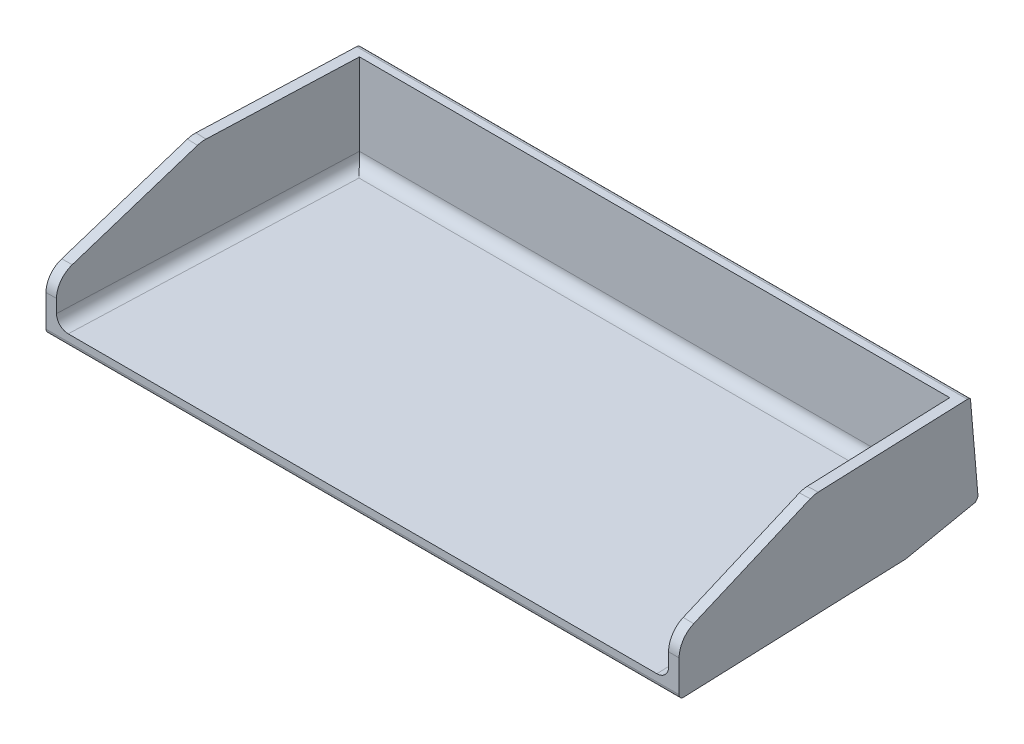
ISO-10303-21;
HEADER;
FILE_DESCRIPTION(('STEP AP214'),'2;1');
FILE_NAME('part.step','',(''),(''),'','','');
FILE_SCHEMA(('AUTOMOTIVE_DESIGN { 1 0 10303 214 1 1 1 1 }'));
ENDSEC;
DATA;
#1=APPLICATION_CONTEXT('core data for automotive mechanical design processes');
#2=APPLICATION_PROTOCOL_DEFINITION('international standard','automotive_design',2000,#1);
#3=PRODUCT_CONTEXT('',#1,'mechanical');
#4=PRODUCT('Part','Part','',(#3));
#5=PRODUCT_RELATED_PRODUCT_CATEGORY('part','',(#4));
#6=PRODUCT_DEFINITION_FORMATION('','',#4);
#7=PRODUCT_DEFINITION_CONTEXT('part definition',#1,'design');
#8=PRODUCT_DEFINITION('design','',#6,#7);
#9=PRODUCT_DEFINITION_SHAPE('','',#8);
#10=(LENGTH_UNIT() NAMED_UNIT(*) SI_UNIT(.MILLI.,.METRE.));
#11=(NAMED_UNIT(*) PLANE_ANGLE_UNIT() SI_UNIT($,.RADIAN.));
#12=(NAMED_UNIT(*) SI_UNIT($,.STERADIAN.) SOLID_ANGLE_UNIT());
#13=UNCERTAINTY_MEASURE_WITH_UNIT(LENGTH_MEASURE(1.E-05),#10,'distance_accuracy_value','');
#14=(GEOMETRIC_REPRESENTATION_CONTEXT(3) GLOBAL_UNCERTAINTY_ASSIGNED_CONTEXT((#13)) GLOBAL_UNIT_ASSIGNED_CONTEXT((#10,
#11,#12)) REPRESENTATION_CONTEXT('',''));
#15=CARTESIAN_POINT('',(0.,0.,0.));
#16=DIRECTION('',(0.,0.,1.));
#17=DIRECTION('',(1.,0.,0.));
#18=AXIS2_PLACEMENT_3D('',#15,#16,#17);
#19=CARTESIAN_POINT('',(0.,43.,-128.169892089231));
#20=DIRECTION('',(-1.,0.,0.));
#21=DIRECTION('',(0.,0.,1.));
#22=AXIS2_PLACEMENT_3D('',#19,#20,#21);
#23=CYLINDRICAL_SURFACE('',#22,2.);
#24=CARTESIAN_POINT('',(266.717193387957,43.,-128.169892089231));
#25=DIRECTION('',(-0.999304579951777,0.,0.037287484326559));
#26=DIRECTION('',(-0.037287484326559,0.,-0.999304579951777));
#27=AXIS2_PLACEMENT_3D('',#24,#25,#26);
#28=ELLIPSE('',#27,2.00139180798762,2.);
#29=CARTESIAN_POINT('',(266.665813469005,44.4504899329398,-129.546873917157));
#30=VERTEX_POINT('',#29);
#31=CARTESIAN_POINT('',(266.717193387957,45.,-128.169892089231));
#32=VERTEX_POINT('',#31);
#33=EDGE_CURVE('E181',#30,#32,#28,.F.);
#34=ORIENTED_EDGE('',*,*,#33,.F.);
#35=DIRECTION('',(-1.,0.,0.));
#36=VECTOR('',#35,1.);
#37=CARTESIAN_POINT('',(0.,44.4504899329398,-129.546873917157));
#38=LINE('',#37,#36);
#39=CARTESIAN_POINT('',(5.33418653099532,44.4504899329398,-129.546873917158));
#40=VERTEX_POINT('',#39);
#41=EDGE_CURVE('E170',#30,#40,#38,.T.);
#42=ORIENTED_EDGE('',*,*,#41,.T.);
#43=CARTESIAN_POINT('',(5.28280661204283,43.,-128.169892089231));
#44=DIRECTION('',(0.999304579951777,0.,0.0372874843265588));
#45=DIRECTION('',(-0.0372874843265588,0.,0.999304579951777));
#46=AXIS2_PLACEMENT_3D('',#43,#44,#45);
#47=ELLIPSE('',#46,2.00139180798762,2.);
#48=CARTESIAN_POINT('',(5.28280661204283,45.,-128.169892089231));
#49=VERTEX_POINT('',#48);
#50=EDGE_CURVE('E179',#49,#40,#47,.F.);
#51=ORIENTED_EDGE('',*,*,#50,.F.);
#52=DIRECTION('',(-1.,0.,0.));
#53=VECTOR('',#52,1.);
#54=CARTESIAN_POINT('',(0.,45.,-128.169892089231));
#55=LINE('',#54,#53);
#56=EDGE_CURVE('E315',#32,#49,#55,.T.);
#57=ORIENTED_EDGE('',*,*,#56,.F.);
#58=EDGE_LOOP('',(#34,#42,#51,#57));
#59=FACE_BOUND('',#58,.T.);
#60=ADVANCED_FACE('F33',(#59),#23,.T.);
#61=CARTESIAN_POINT('',(-55.7709361070454,8.48224818282541,-128.226308162382));
#62=DIRECTION('',(1.,0.,0.));
#63=DIRECTION('',(0.,0.,-1.));
#64=AXIS2_PLACEMENT_3D('',#61,#62,#63);
#65=CYLINDRICAL_SURFACE('',#64,5.);
#66=CARTESIAN_POINT('',(5.2849116893992,8.48224818282541,-128.226308162382));
#67=DIRECTION('',(0.999304579951777,0.,0.0372874843265588));
#68=DIRECTION('',(0.0372874843265588,0.,-0.999304579951777));
#69=AXIS2_PLACEMENT_3D('',#66,#67,#68);
#70=ELLIPSE('',#69,5.00347951996906,5.);
#71=CARTESIAN_POINT('',(5.45936299097688,6.70978724849995,-132.901603044663));
#72=VERTEX_POINT('',#71);
#73=CARTESIAN_POINT('',(5.41879334504449,5.,-131.814336533675));
#74=VERTEX_POINT('',#73);
#75=EDGE_CURVE('E41',#72,#74,#70,.F.);
#76=ORIENTED_EDGE('',*,*,#75,.F.);
#77=DIRECTION('',(1.,0.,0.));
#78=VECTOR('',#77,1.);
#79=CARTESIAN_POINT('',(-55.7709361070454,6.70978724849992,-132.901603044663));
#80=LINE('',#79,#78);
#81=CARTESIAN_POINT('',(266.540637009023,6.70978724849992,-132.901603044663));
#82=VERTEX_POINT('',#81);
#83=EDGE_CURVE('E47',#72,#82,#80,.T.);
#84=ORIENTED_EDGE('',*,*,#83,.T.);
#85=CARTESIAN_POINT('',(266.715088310601,8.48224818282541,-128.226308162382));
#86=DIRECTION('',(-0.999304579951777,0.,0.037287484326559));
#87=DIRECTION('',(0.037287484326559,0.,0.999304579951777));
#88=AXIS2_PLACEMENT_3D('',#85,#86,#87);
#89=ELLIPSE('',#88,5.00347951996906,5.);
#90=CARTESIAN_POINT('',(266.581206654956,5.,-131.814336533675));
#91=VERTEX_POINT('',#90);
#92=EDGE_CURVE('E317',#91,#82,#89,.F.);
#93=ORIENTED_EDGE('',*,*,#92,.F.);
#94=DIRECTION('',(1.,0.,0.));
#95=VECTOR('',#94,1.);
#96=CARTESIAN_POINT('',(-55.7709361070454,5.,-131.814336533675));
#97=LINE('',#96,#95);
#98=EDGE_CURVE('E55',#74,#91,#97,.T.);
#99=ORIENTED_EDGE('',*,*,#98,.F.);
#100=EDGE_LOOP('',(#76,#84,#93,#99));
#101=FACE_BOUND('',#100,.T.);
#102=ADVANCED_FACE('F35',(#101),#65,.T.);
#103=CARTESIAN_POINT('',(271.122170745451,0.,-10.1164989084124));
#104=DIRECTION('',(-0.999304579951777,0.,0.037287484326559));
#105=DIRECTION('',(0.037287484326559,0.,0.999304579951777));
#106=AXIS2_PLACEMENT_3D('',#103,#104,#105);
#107=PLANE('',#106);
#108=DIRECTION('',(-0.00330370548880731,-0.996067204875398,-0.0885393071000354));
#109=VECTOR('',#108,1.);
#110=CARTESIAN_POINT('',(266.554522632027,10.8963025840758,-132.529468348168));
#111=LINE('',#110,#109);
#112=EDGE_CURVE('E182',#30,#82,#111,.T.);
#113=ORIENTED_EDGE('',*,*,#112,.F.);
#114=ORIENTED_EDGE('',*,*,#33,.T.);
#115=DIRECTION('',(-0.037287484326559,0.,-0.999304579951777));
#116=VECTOR('',#115,1.);
#117=CARTESIAN_POINT('',(271.122170745451,45.,-10.1164989084124));
#118=LINE('',#117,#116);
#119=CARTESIAN_POINT('',(269.192205568468,45.,-61.8395656515565));
#120=VERTEX_POINT('',#119);
#121=EDGE_CURVE('E215',#120,#32,#118,.T.);
#122=ORIENTED_EDGE('',*,*,#121,.F.);
#123=CARTESIAN_POINT('',(269.192205568468,35.,-61.8395656515565));
#124=DIRECTION('',(-0.999304579951777,0.,0.037287484326559));
#125=DIRECTION('',(0.037287484326559,0.,0.999304579951777));
#126=AXIS2_PLACEMENT_3D('',#123,#124,#125);
#127=CIRCLE('',#126,10.);
#128=CARTESIAN_POINT('',(269.322957809309,44.3650288928351,-58.33540559701));
#129=VERTEX_POINT('',#128);
#130=EDGE_CURVE('E221',#120,#129,#127,.F.);
#131=ORIENTED_EDGE('',*,*,#130,.T.);
#132=DIRECTION('',(-0.0349198368059359,0.350659861352347,-0.935851626399078));
#133=VECTOR('',#132,1.);
#134=CARTESIAN_POINT('',(271.500347710024,22.5,0.0186437421632748));
#135=LINE('',#134,#133);
#136=CARTESIAN_POINT('',(271.257269960486,24.9409509822315,-6.49583994545344));
#137=VERTEX_POINT('',#136);
#138=EDGE_CURVE('E225',#137,#129,#135,.T.);
#139=ORIENTED_EDGE('',*,*,#138,.F.);
#140=CARTESIAN_POINT('',(271.126517719645,15.5759220893965,-10.));
#141=DIRECTION('',(-0.999304579951777,0.,0.037287484326559));
#142=DIRECTION('',(-0.0349198368059359,0.350659861352346,-0.935851626399079));
#143=AXIS2_PLACEMENT_3D('',#140,#141,#142);
#144=ELLIPSE('',#143,10.0079343237185,10.);
#145=CARTESIAN_POINT('',(271.499652048003,15.5707124792473,0.));
#146=VERTEX_POINT('',#145);
#147=EDGE_CURVE('E223',#137,#146,#144,.F.);
#148=ORIENTED_EDGE('',*,*,#147,.T.);
#149=DIRECTION('',(0.,1.,0.));
#150=VECTOR('',#149,1.);
#151=CARTESIAN_POINT('',(271.499652048003,45.,0.));
#152=LINE('',#151,#150);
#153=CARTESIAN_POINT('',(271.499652048003,2.,0.));
#154=VERTEX_POINT('',#153);
#155=EDGE_CURVE('E218',#154,#146,#152,.T.);
#156=ORIENTED_EDGE('',*,*,#155,.F.);
#157=CARTESIAN_POINT('',(271.425025182332,2.,-2.));
#158=DIRECTION('',(-0.999304579951777,0.,0.037287484326559));
#159=DIRECTION('',(-0.037287484326559,0.,-0.999304579951777));
#160=AXIS2_PLACEMENT_3D('',#157,#158,#159);
#161=ELLIPSE('',#160,2.00139180798762,2.);
#162=CARTESIAN_POINT('',(271.425025182332,0.,-2.));
#163=VERTEX_POINT('',#162);
#164=EDGE_CURVE('E213',#154,#163,#161,.F.);
#165=ORIENTED_EDGE('',*,*,#164,.T.);
#166=DIRECTION('',(0.037287484326559,0.,0.999304579951777));
#167=VECTOR('',#166,1.);
#168=CARTESIAN_POINT('',(271.122170745451,0.,-10.1164989084124));
#169=LINE('',#168,#167);
#170=CARTESIAN_POINT('',(267.736927504683,0.,-100.841017760975));
#171=VERTEX_POINT('',#170);
#172=EDGE_CURVE('E209',#171,#163,#169,.T.);
#173=ORIENTED_EDGE('',*,*,#172,.F.);
#174=DIRECTION('',(0.0368115834188894,-0.159258109030245,0.98655043562623));
#175=VECTOR('',#174,1.);
#176=CARTESIAN_POINT('',(268.452699109656,-3.09664572176336,-81.6583387477167));
#177=LINE('',#176,#175);
#178=EDGE_CURVE('E207',#91,#171,#177,.T.);
#179=ORIENTED_EDGE('',*,*,#178,.F.);
#180=ORIENTED_EDGE('',*,*,#92,.T.);
#181=EDGE_LOOP('',(#113,#114,#122,#131,#139,#148,#156,#165,#173,#179,#180));
#182=FACE_BOUND('',#181,.T.);
#183=ADVANCED_FACE('F324',(#182),#107,.F.);
#184=CARTESIAN_POINT('',(0.499652289975889,0.,0.0186437421632794));
#185=DIRECTION('',(0.999304579951777,0.,0.0372874843265588));
#186=DIRECTION('',(0.0372874843265588,0.,-0.999304579951777));
#187=AXIS2_PLACEMENT_3D('',#184,#185,#186);
#188=PLANE('',#187);
#189=DIRECTION('',(-0.00330370548880729,0.996067204875398,0.0885393071000354));
#190=VECTOR('',#189,1.);
#191=CARTESIAN_POINT('',(5.44250863214507,11.7913764362911,-132.449906227971));
#192=LINE('',#191,#190);
#193=EDGE_CURVE('E11',#72,#40,#192,.T.);
#194=ORIENTED_EDGE('',*,*,#193,.F.);
#195=ORIENTED_EDGE('',*,*,#75,.T.);
#196=DIRECTION('',(0.0368115834188892,0.159258109030245,-0.98655043562623));
#197=VECTOR('',#196,1.);
#198=CARTESIAN_POINT('',(3.02756610920945,-5.34517650347241,-67.7294466132962));
#199=LINE('',#198,#197);
#200=CARTESIAN_POINT('',(4.26307249531688,0.,-100.841017760975));
#201=VERTEX_POINT('',#200);
#202=EDGE_CURVE('E192',#201,#74,#199,.T.);
#203=ORIENTED_EDGE('',*,*,#202,.F.);
#204=DIRECTION('',(0.0372874843265588,0.,-0.999304579951777));
#205=VECTOR('',#204,1.);
#206=CARTESIAN_POINT('',(0.499652289975889,0.,0.0186437421632794));
#207=LINE('',#206,#205);
#208=CARTESIAN_POINT('',(0.574974817668549,0.,-2.));
#209=VERTEX_POINT('',#208);
#210=EDGE_CURVE('E188',#209,#201,#207,.T.);
#211=ORIENTED_EDGE('',*,*,#210,.F.);
#212=CARTESIAN_POINT('',(0.574974817668549,2.,-2.));
#213=DIRECTION('',(0.999304579951777,0.,0.0372874843265588));
#214=DIRECTION('',(-0.0372874843265588,0.,0.999304579951777));
#215=AXIS2_PLACEMENT_3D('',#212,#213,#214);
#216=ELLIPSE('',#215,2.00139180798762,2.);
#217=CARTESIAN_POINT('',(0.500347951996937,2.,0.));
#218=VERTEX_POINT('',#217);
#219=EDGE_CURVE('E187',#209,#218,#216,.F.);
#220=ORIENTED_EDGE('',*,*,#219,.T.);
#221=DIRECTION('',(0.,-1.,0.));
#222=VECTOR('',#221,1.);
#223=CARTESIAN_POINT('',(0.500347951996907,45.,0.));
#224=LINE('',#223,#222);
#225=CARTESIAN_POINT('',(0.500347951996907,15.5707124792473,0.));
#226=VERTEX_POINT('',#225);
#227=EDGE_CURVE('E197',#226,#218,#224,.T.);
#228=ORIENTED_EDGE('',*,*,#227,.F.);
#229=CARTESIAN_POINT('',(0.873482280355116,15.5759220893965,-10.));
#230=DIRECTION('',(0.999304579951777,0.,0.0372874843265588));
#231=DIRECTION('',(-0.0349198368059357,-0.350659861352347,0.935851626399078));
#232=AXIS2_PLACEMENT_3D('',#229,#230,#231);
#233=ELLIPSE('',#232,10.0079343237185,10.);
#234=CARTESIAN_POINT('',(0.742730039513826,24.9409509822315,-6.49583994545344));
#235=VERTEX_POINT('',#234);
#236=EDGE_CURVE('E202',#226,#235,#233,.F.);
#237=ORIENTED_EDGE('',*,*,#236,.T.);
#238=DIRECTION('',(-0.0349198368059357,-0.350659861352347,0.935851626399078));
#239=VECTOR('',#238,1.);
#240=CARTESIAN_POINT('',(0.499652289975889,22.5,0.0186437421632795));
#241=LINE('',#240,#239);
#242=CARTESIAN_POINT('',(2.67704219069131,44.365028892835,-58.3354055970099));
#243=VERTEX_POINT('',#242);
#244=EDGE_CURVE('E204',#243,#235,#241,.T.);
#245=ORIENTED_EDGE('',*,*,#244,.F.);
#246=CARTESIAN_POINT('',(2.8077944315326,35.,-61.8395656515565));
#247=DIRECTION('',(0.999304579951777,0.,0.0372874843265588));
#248=DIRECTION('',(0.0372874843265588,0.,-0.999304579951777));
#249=AXIS2_PLACEMENT_3D('',#246,#247,#248);
#250=CIRCLE('',#249,10.);
#251=CARTESIAN_POINT('',(2.8077944315326,45.,-61.8395656515565));
#252=VERTEX_POINT('',#251);
#253=EDGE_CURVE('E200',#243,#252,#250,.F.);
#254=ORIENTED_EDGE('',*,*,#253,.T.);
#255=DIRECTION('',(-0.0372874843265588,0.,0.999304579951777));
#256=VECTOR('',#255,1.);
#257=CARTESIAN_POINT('',(0.499652289975889,45.,0.0186437421632794));
#258=LINE('',#257,#256);
#259=EDGE_CURVE('E186',#49,#252,#258,.T.);
#260=ORIENTED_EDGE('',*,*,#259,.F.);
#261=ORIENTED_EDGE('',*,*,#50,.T.);
#262=EDGE_LOOP('',(#194,#195,#203,#211,#220,#228,#237,#245,#254,#260,#261));
#263=FACE_BOUND('',#262,.T.);
#264=ADVANCED_FACE('F184',(#263),#188,.F.);
#265=CARTESIAN_POINT('',(0.,45.,0.));
#266=DIRECTION('',(0.,0.,-1.));
#267=DIRECTION('',(-1.,0.,0.));
#268=AXIS2_PLACEMENT_3D('',#265,#266,#267);
#269=PLANE('',#268);
#270=DIRECTION('',(-0.999902548942784,-0.0139603946120456,0.));
#271=VECTOR('',#270,1.);
#272=CARTESIAN_POINT('',(0.41090194383554,15.5694636559777,0.));
#273=LINE('',#272,#271);
#274=CARTESIAN_POINT('',(5.,15.633535519626,0.));
#275=VERTEX_POINT('',#274);
#276=EDGE_CURVE('E261',#275,#226,#273,.T.);
#277=ORIENTED_EDGE('',*,*,#276,.T.);
#278=ORIENTED_EDGE('',*,*,#227,.T.);
#279=DIRECTION('',(1.,0.,0.));
#280=VECTOR('',#279,1.);
#281=CARTESIAN_POINT('',(272.,2.,0.));
#282=LINE('',#281,#280);
#283=EDGE_CURVE('E310',#218,#154,#282,.T.);
#284=ORIENTED_EDGE('',*,*,#283,.T.);
#285=ORIENTED_EDGE('',*,*,#155,.T.);
#286=DIRECTION('',(-0.999902548942784,0.0139603946120456,0.));
#287=VECTOR('',#286,1.);
#288=CARTESIAN_POINT('',(-0.357891151814604,19.3663209466359,0.));
#289=LINE('',#288,#287);
#290=CARTESIAN_POINT('',(267.,15.633535519626,0.));
#291=VERTEX_POINT('',#290);
#292=EDGE_CURVE('E264',#146,#291,#289,.T.);
#293=ORIENTED_EDGE('',*,*,#292,.T.);
#294=DIRECTION('',(0.,1.,0.));
#295=VECTOR('',#294,1.);
#296=CARTESIAN_POINT('',(267.,5.,0.));
#297=LINE('',#296,#295);
#298=CARTESIAN_POINT('',(267.,10.,0.));
#299=VERTEX_POINT('',#298);
#300=EDGE_CURVE('E252',#299,#291,#297,.T.);
#301=ORIENTED_EDGE('',*,*,#300,.F.);
#302=CARTESIAN_POINT('',(261.996520480031,10.,0.));
#303=DIRECTION('',(0.,0.,-1.));
#304=DIRECTION('',(1.,0.,0.));
#305=AXIS2_PLACEMENT_3D('',#302,#303,#304);
#306=ELLIPSE('',#305,5.00347951996906,5.);
#307=CARTESIAN_POINT('',(261.996520480031,5.,0.));
#308=VERTEX_POINT('',#307);
#309=EDGE_CURVE('E289',#299,#308,#306,.T.);
#310=ORIENTED_EDGE('',*,*,#309,.T.);
#311=DIRECTION('',(1.,0.,0.));
#312=VECTOR('',#311,1.);
#313=CARTESIAN_POINT('',(5.,5.,0.));
#314=LINE('',#313,#312);
#315=CARTESIAN_POINT('',(10.0034795199691,5.,0.));
#316=VERTEX_POINT('',#315);
#317=EDGE_CURVE('E233',#316,#308,#314,.T.);
#318=ORIENTED_EDGE('',*,*,#317,.F.);
#319=CARTESIAN_POINT('',(10.0034795199691,10.,0.));
#320=DIRECTION('',(0.,0.,-1.));
#321=DIRECTION('',(1.,0.,0.));
#322=AXIS2_PLACEMENT_3D('',#319,#320,#321);
#323=ELLIPSE('',#322,5.00347951996906,5.);
#324=CARTESIAN_POINT('',(5.,10.,0.));
#325=VERTEX_POINT('',#324);
#326=EDGE_CURVE('E291',#316,#325,#323,.T.);
#327=ORIENTED_EDGE('',*,*,#326,.T.);
#328=DIRECTION('',(0.,1.,0.));
#329=VECTOR('',#328,1.);
#330=CARTESIAN_POINT('',(5.,5.,0.));
#331=LINE('',#330,#329);
#332=EDGE_CURVE('E236',#325,#275,#331,.T.);
#333=ORIENTED_EDGE('',*,*,#332,.T.);
#334=EDGE_LOOP('',(#277,#278,#284,#285,#293,#301,#310,#318,#327,#333));
#335=FACE_BOUND('',#334,.T.);
#336=ADVANCED_FACE('F335',(#335),#269,.F.);
#337=CARTESIAN_POINT('',(0.,45.,0.));
#338=DIRECTION('',(0.,-1.,0.));
#339=DIRECTION('',(0.,0.,-1.));
#340=AXIS2_PLACEMENT_3D('',#337,#338,#339);
#341=PLANE('',#340);
#342=ORIENTED_EDGE('',*,*,#56,.T.);
#343=ORIENTED_EDGE('',*,*,#259,.T.);
#344=DIRECTION('',(-0.999304579951777,0.,-0.0372874843265588));
#345=VECTOR('',#344,1.);
#346=CARTESIAN_POINT('',(2.30814214155671,45.,-61.8582093937198));
#347=LINE('',#346,#345);
#348=CARTESIAN_POINT('',(7.30119035911966,45.,-61.6719016244077));
#349=VERTEX_POINT('',#348);
#350=EDGE_CURVE('E293',#252,#349,#347,.F.);
#351=ORIENTED_EDGE('',*,*,#350,.T.);
#352=DIRECTION('',(-0.0372874843265584,0.,0.999304579951777));
#353=VECTOR('',#352,1.);
#354=CARTESIAN_POINT('',(5.,45.,0.));
#355=LINE('',#354,#353);
#356=CARTESIAN_POINT('',(9.66417910447755,45.,-125.));
#357=VERTEX_POINT('',#356);
#358=EDGE_CURVE('E238',#357,#349,#355,.T.);
#359=ORIENTED_EDGE('',*,*,#358,.F.);
#360=DIRECTION('',(-1.,0.,0.));
#361=VECTOR('',#360,1.);
#362=CARTESIAN_POINT('',(9.66417910447755,45.,-125.));
#363=LINE('',#362,#361);
#364=CARTESIAN_POINT('',(262.335820895522,45.,-125.));
#365=VERTEX_POINT('',#364);
#366=EDGE_CURVE('E237',#365,#357,#363,.T.);
#367=ORIENTED_EDGE('',*,*,#366,.F.);
#368=DIRECTION('',(-0.037287484326559,0.,-0.999304579951777));
#369=VECTOR('',#368,1.);
#370=CARTESIAN_POINT('',(262.335820895522,45.,-125.));
#371=LINE('',#370,#369);
#372=CARTESIAN_POINT('',(264.69880964088,45.,-61.6719016244077));
#373=VERTEX_POINT('',#372);
#374=EDGE_CURVE('E241',#373,#365,#371,.T.);
#375=ORIENTED_EDGE('',*,*,#374,.F.);
#376=DIRECTION('',(0.999304579951777,0.,-0.0372874843265589));
#377=VECTOR('',#376,1.);
#378=CARTESIAN_POINT('',(-1.92996517698299,45.,-51.7230667431442));
#379=LINE('',#378,#377);
#380=EDGE_CURVE('E298',#373,#120,#379,.T.);
#381=ORIENTED_EDGE('',*,*,#380,.T.);
#382=ORIENTED_EDGE('',*,*,#121,.T.);
#383=EDGE_LOOP('',(#342,#343,#351,#359,#367,#375,#381,#382));
#384=FACE_BOUND('',#383,.T.);
#385=ADVANCED_FACE('F355',(#384),#341,.F.);
#386=CARTESIAN_POINT('',(5.,5.,0.));
#387=DIRECTION('',(-0.999304579951777,0.,-0.0372874843265584));
#388=DIRECTION('',(-0.0372874843265584,0.,0.999304579951777));
#389=AXIS2_PLACEMENT_3D('',#386,#387,#388);
#390=PLANE('',#389);
#391=ORIENTED_EDGE('',*,*,#358,.T.);
#392=CARTESIAN_POINT('',(7.30119035911966,35.,-61.6719016244077));
#393=DIRECTION('',(-0.999304579951777,0.,-0.0372874843265584));
#394=DIRECTION('',(-0.0372874843265584,0.,0.999304579951777));
#395=AXIS2_PLACEMENT_3D('',#392,#393,#394);
#396=CIRCLE('',#395,10.);
#397=CARTESIAN_POINT('',(7.17043811827837,44.365028892835,-58.1677415698612));
#398=VERTEX_POINT('',#397);
#399=EDGE_CURVE('E308',#349,#398,#396,.F.);
#400=ORIENTED_EDGE('',*,*,#399,.T.);
#401=DIRECTION('',(-0.0349198368059353,-0.350659861352347,0.935851626399078));
#402=VECTOR('',#401,1.);
#403=CARTESIAN_POINT('',(4.78485795275147,20.4093840043003,5.76580686626064));
#404=LINE('',#403,#402);
#405=CARTESIAN_POINT('',(5.24238208751692,25.0037740226103,-6.49583994545344));
#406=VERTEX_POINT('',#405);
#407=EDGE_CURVE('E248',#398,#406,#404,.T.);
#408=ORIENTED_EDGE('',*,*,#407,.T.);
#409=CARTESIAN_POINT('',(5.3731343283582,15.6387451297752,-10.));
#410=DIRECTION('',(-0.999304579951777,0.,-0.0372874843265584));
#411=DIRECTION('',(-0.0349198368059353,-0.350659861352351,0.935851626399077));
#412=AXIS2_PLACEMENT_3D('',#409,#410,#411);
#413=ELLIPSE('',#412,10.0079343237185,10.);
#414=EDGE_CURVE('E273',#406,#275,#413,.F.);
#415=ORIENTED_EDGE('',*,*,#414,.T.);
#416=ORIENTED_EDGE('',*,*,#332,.F.);
#417=DIRECTION('',(-0.0372874843265584,0.,0.999304579951777));
#418=VECTOR('',#417,1.);
#419=CARTESIAN_POINT('',(9.66417910447755,10.,-125.));
#420=LINE('',#419,#418);
#421=CARTESIAN_POINT('',(9.66417910447755,10.,-125.));
#422=VERTEX_POINT('',#421);
#423=EDGE_CURVE('E287',#325,#422,#420,.F.);
#424=ORIENTED_EDGE('',*,*,#423,.T.);
#425=DIRECTION('',(0.,1.,0.));
#426=VECTOR('',#425,1.);
#427=CARTESIAN_POINT('',(9.66417910447755,5.,-125.));
#428=LINE('',#427,#426);
#429=EDGE_CURVE('E246',#422,#357,#428,.T.);
#430=ORIENTED_EDGE('',*,*,#429,.T.);
#431=EDGE_LOOP('',(#391,#400,#408,#415,#416,#424,#430));
#432=FACE_BOUND('',#431,.T.);
#433=ADVANCED_FACE('F384',(#432),#390,.F.);
#434=CARTESIAN_POINT('',(9.66417910447755,5.,-125.));
#435=DIRECTION('',(0.,0.,-1.));
#436=DIRECTION('',(-1.,0.,0.));
#437=AXIS2_PLACEMENT_3D('',#434,#435,#436);
#438=PLANE('',#437);
#439=ORIENTED_EDGE('',*,*,#429,.F.);
#440=DIRECTION('',(-1.,0.,0.));
#441=VECTOR('',#440,1.);
#442=CARTESIAN_POINT('',(262.335820895522,10.,-125.));
#443=LINE('',#442,#441);
#444=CARTESIAN_POINT('',(262.335820895522,10.,-125.));
#445=VERTEX_POINT('',#444);
#446=EDGE_CURVE('E285',#422,#445,#443,.F.);
#447=ORIENTED_EDGE('',*,*,#446,.T.);
#448=DIRECTION('',(0.,1.,0.));
#449=VECTOR('',#448,1.);
#450=CARTESIAN_POINT('',(262.335820895522,5.,-125.));
#451=LINE('',#450,#449);
#452=EDGE_CURVE('E249',#445,#365,#451,.T.);
#453=ORIENTED_EDGE('',*,*,#452,.T.);
#454=ORIENTED_EDGE('',*,*,#366,.T.);
#455=EDGE_LOOP('',(#439,#447,#453,#454));
#456=FACE_BOUND('',#455,.T.);
#457=ADVANCED_FACE('F362',(#456),#438,.F.);
#458=CARTESIAN_POINT('',(262.335820895522,5.,-125.));
#459=DIRECTION('',(0.999304579951777,0.,-0.037287484326559));
#460=DIRECTION('',(-0.037287484326559,0.,-0.999304579951777));
#461=AXIS2_PLACEMENT_3D('',#458,#459,#460);
#462=PLANE('',#461);
#463=DIRECTION('',(-0.034919836805936,0.350659861352347,-0.935851626399078));
#464=VECTOR('',#463,1.);
#465=CARTESIAN_POINT('',(263.124481312004,61.487197003025,-103.863900838283));
#466=LINE('',#465,#464);
#467=CARTESIAN_POINT('',(266.757617912483,25.0037740226102,-6.49583994545343));
#468=VERTEX_POINT('',#467);
#469=CARTESIAN_POINT('',(264.829561881722,44.365028892835,-58.1677415698612));
#470=VERTEX_POINT('',#469);
#471=EDGE_CURVE('E258',#468,#470,#466,.T.);
#472=ORIENTED_EDGE('',*,*,#471,.T.);
#473=CARTESIAN_POINT('',(264.69880964088,35.,-61.6719016244077));
#474=DIRECTION('',(0.999304579951777,0.,-0.037287484326559));
#475=DIRECTION('',(-0.037287484326559,0.,-0.999304579951777));
#476=AXIS2_PLACEMENT_3D('',#473,#474,#475);
#477=CIRCLE('',#476,10.);
#478=EDGE_CURVE('E303',#470,#373,#477,.F.);
#479=ORIENTED_EDGE('',*,*,#478,.T.);
#480=ORIENTED_EDGE('',*,*,#374,.T.);
#481=ORIENTED_EDGE('',*,*,#452,.F.);
#482=DIRECTION('',(-0.037287484326559,0.,-0.999304579951777));
#483=VECTOR('',#482,1.);
#484=CARTESIAN_POINT('',(267.,10.,0.));
#485=LINE('',#484,#483);
#486=EDGE_CURVE('E283',#445,#299,#485,.F.);
#487=ORIENTED_EDGE('',*,*,#486,.T.);
#488=ORIENTED_EDGE('',*,*,#300,.T.);
#489=CARTESIAN_POINT('',(266.626865671642,15.6387451297752,-10.));
#490=DIRECTION('',(0.999304579951777,0.,-0.037287484326559));
#491=DIRECTION('',(-0.034919836805936,0.350659861352346,-0.935851626399079));
#492=AXIS2_PLACEMENT_3D('',#489,#490,#491);
#493=ELLIPSE('',#492,10.0079343237185,10.);
#494=EDGE_CURVE('E266',#291,#468,#493,.F.);
#495=ORIENTED_EDGE('',*,*,#494,.T.);
#496=EDGE_LOOP('',(#472,#479,#480,#481,#487,#488,#495));
#497=FACE_BOUND('',#496,.T.);
#498=ADVANCED_FACE('F348',(#497),#462,.F.);
#499=CARTESIAN_POINT('',(0.,5.,0.));
#500=DIRECTION('',(0.,-1.,0.));
#501=DIRECTION('',(0.,0.,-1.));
#502=AXIS2_PLACEMENT_3D('',#499,#500,#501);
#503=PLANE('',#502);
#504=ORIENTED_EDGE('',*,*,#317,.T.);
#505=DIRECTION('',(-0.037287484326559,0.,-0.999304579951777));
#506=VECTOR('',#505,1.);
#507=CARTESIAN_POINT('',(257.339297995764,5.,-124.813562578367));
#508=LINE('',#507,#506);
#509=CARTESIAN_POINT('',(257.518908539732,5.,-120.));
#510=VERTEX_POINT('',#509);
#511=EDGE_CURVE('E280',#308,#510,#508,.T.);
#512=ORIENTED_EDGE('',*,*,#511,.T.);
#513=DIRECTION('',(-1.,0.,0.));
#514=VECTOR('',#513,1.);
#515=CARTESIAN_POINT('',(9.66417910447755,5.,-120.));
#516=LINE('',#515,#514);
#517=CARTESIAN_POINT('',(14.4810914602675,5.,-120.));
#518=VERTEX_POINT('',#517);
#519=EDGE_CURVE('E278',#510,#518,#516,.T.);
#520=ORIENTED_EDGE('',*,*,#519,.T.);
#521=DIRECTION('',(-0.0372874843265584,0.,0.999304579951777));
#522=VECTOR('',#521,1.);
#523=CARTESIAN_POINT('',(9.99652289975888,5.,0.186437421632792));
#524=LINE('',#523,#522);
#525=EDGE_CURVE('E276',#518,#316,#524,.T.);
#526=ORIENTED_EDGE('',*,*,#525,.T.);
#527=EDGE_LOOP('',(#504,#512,#520,#526));
#528=FACE_BOUND('',#527,.T.);
#529=ADVANCED_FACE('F377',(#528),#503,.F.);
#530=CARTESIAN_POINT('',(4.99652289975888,22.5,0.186437421632794));
#531=DIRECTION('',(0.0130752240841289,-0.936502889283505,-0.350416005454656));
#532=DIRECTION('',(0.,0.350445963116219,-0.936582952511707));
#533=AXIS2_PLACEMENT_3D('',#530,#531,#532);
#534=PLANE('',#533);
#535=DIRECTION('',(-0.999304579951777,0.,-0.0372874843265588));
#536=VECTOR('',#535,1.);
#537=CARTESIAN_POINT('',(7.1739128004743,44.365028892835,-58.1676119175404));
#538=LINE('',#537,#536);
#539=EDGE_CURVE('E305',#398,#243,#538,.T.);
#540=ORIENTED_EDGE('',*,*,#539,.T.);
#541=ORIENTED_EDGE('',*,*,#244,.T.);
#542=DIRECTION('',(-0.999902548942784,-0.0139603946120456,0.));
#543=VECTOR('',#542,1.);
#544=CARTESIAN_POINT('',(4.96162054879697,24.9998540987371,-6.49583994545344));
#545=LINE('',#544,#543);
#546=EDGE_CURVE('E271',#235,#406,#545,.F.);
#547=ORIENTED_EDGE('',*,*,#546,.T.);
#548=ORIENTED_EDGE('',*,*,#407,.F.);
#549=EDGE_LOOP('',(#540,#541,#547,#548));
#550=FACE_BOUND('',#549,.T.);
#551=ADVANCED_FACE('F394',(#550),#534,.F.);
#552=CARTESIAN_POINT('',(267.003477100241,22.5,0.186437421632793));
#553=DIRECTION('',(-0.013075224084129,-0.936502889283505,-0.350416005454656));
#554=DIRECTION('',(0.,0.350445963116219,-0.936582952511707));
#555=AXIS2_PLACEMENT_3D('',#552,#553,#554);
#556=PLANE('',#555);
#557=DIRECTION('',(-0.999902548942784,0.0139603946120456,0.));
#558=VECTOR('',#557,1.);
#559=CARTESIAN_POINT('',(267.038379451203,24.9998540987371,-6.49583994545344));
#560=LINE('',#559,#558);
#561=EDGE_CURVE('E268',#468,#137,#560,.F.);
#562=ORIENTED_EDGE('',*,*,#561,.T.);
#563=ORIENTED_EDGE('',*,*,#138,.T.);
#564=DIRECTION('',(0.999304579951777,0.,-0.0372874843265589));
#565=VECTOR('',#564,1.);
#566=CARTESIAN_POINT('',(264.826087199526,44.3650288928351,-58.1676119175404));
#567=LINE('',#566,#565);
#568=EDGE_CURVE('E301',#129,#470,#567,.F.);
#569=ORIENTED_EDGE('',*,*,#568,.T.);
#570=ORIENTED_EDGE('',*,*,#471,.F.);
#571=EDGE_LOOP('',(#562,#563,#569,#570));
#572=FACE_BOUND('',#571,.T.);
#573=ADVANCED_FACE('F344',(#572),#556,.F.);
#574=CARTESIAN_POINT('',(-0.357891151814604,19.3663209466359,-10.));
#575=DIRECTION('',(-0.999902548942784,0.0139603946120456,0.));
#576=DIRECTION('',(-0.0139603946120456,-0.999902548942784,0.));
#577=AXIS2_PLACEMENT_3D('',#574,#575,#576);
#578=CYLINDRICAL_SURFACE('',#577,10.);
#579=ORIENTED_EDGE('',*,*,#147,.F.);
#580=ORIENTED_EDGE('',*,*,#561,.F.);
#581=ORIENTED_EDGE('',*,*,#494,.F.);
#582=ORIENTED_EDGE('',*,*,#292,.F.);
#583=EDGE_LOOP('',(#579,#580,#581,#582));
#584=FACE_BOUND('',#583,.T.);
#585=ADVANCED_FACE('F340',(#584),#578,.T.);
#586=CARTESIAN_POINT('',(0.41090194383554,15.5694636559777,-10.));
#587=DIRECTION('',(-0.999902548942784,-0.0139603946120456,0.));
#588=DIRECTION('',(0.0139603946120456,-0.999902548942784,0.));
#589=AXIS2_PLACEMENT_3D('',#586,#587,#588);
#590=CYLINDRICAL_SURFACE('',#589,10.);
#591=ORIENTED_EDGE('',*,*,#236,.F.);
#592=ORIENTED_EDGE('',*,*,#276,.F.);
#593=ORIENTED_EDGE('',*,*,#414,.F.);
#594=ORIENTED_EDGE('',*,*,#546,.F.);
#595=EDGE_LOOP('',(#591,#592,#593,#594));
#596=FACE_BOUND('',#595,.T.);
#597=ADVANCED_FACE('F391',(#596),#590,.T.);
#598=CARTESIAN_POINT('',(9.98957111732187,10.,0.372745190944841));
#599=DIRECTION('',(0.0372874843265584,0.,-0.999304579951777));
#600=DIRECTION('',(-0.999304579951777,0.,-0.0372874843265584));
#601=AXIS2_PLACEMENT_3D('',#598,#599,#600);
#602=CYLINDRICAL_SURFACE('',#601,5.);
#603=ORIENTED_EDGE('',*,*,#326,.F.);
#604=ORIENTED_EDGE('',*,*,#525,.F.);
#605=CARTESIAN_POINT('',(14.4810914602675,10.,-120.));
#606=DIRECTION('',(0.720169245499472,0.,-0.693798427381268));
#607=DIRECTION('',(0.693798427381268,0.,0.720169245499472));
#608=AXIS2_PLACEMENT_3D('',#605,#606,#607);
#609=ELLIPSE('',#608,6.94281244477784,5.);
#610=EDGE_CURVE('E242',#422,#518,#609,.F.);
#611=ORIENTED_EDGE('',*,*,#610,.F.);
#612=ORIENTED_EDGE('',*,*,#423,.F.);
#613=EDGE_LOOP('',(#603,#604,#611,#612));
#614=FACE_BOUND('',#613,.T.);
#615=ADVANCED_FACE('F380',(#614),#602,.F.);
#616=CARTESIAN_POINT('',(0.,10.,-120.));
#617=DIRECTION('',(1.,0.,0.));
#618=DIRECTION('',(0.,0.,-1.));
#619=AXIS2_PLACEMENT_3D('',#616,#617,#618);
#620=CYLINDRICAL_SURFACE('',#619,5.);
#621=ORIENTED_EDGE('',*,*,#610,.T.);
#622=ORIENTED_EDGE('',*,*,#519,.F.);
#623=CARTESIAN_POINT('',(257.518908539732,10.,-120.));
#624=DIRECTION('',(0.720169245499472,0.,0.693798427381268));
#625=DIRECTION('',(-0.693798427381268,0.,0.720169245499472));
#626=AXIS2_PLACEMENT_3D('',#623,#624,#625);
#627=ELLIPSE('',#626,6.94281244477783,5.);
#628=EDGE_CURVE('E232',#445,#510,#627,.F.);
#629=ORIENTED_EDGE('',*,*,#628,.F.);
#630=ORIENTED_EDGE('',*,*,#446,.F.);
#631=EDGE_LOOP('',(#621,#622,#629,#630));
#632=FACE_BOUND('',#631,.T.);
#633=ADVANCED_FACE('F367',(#632),#620,.F.);
#634=CARTESIAN_POINT('',(261.632251918104,10.,-9.76239745963082));
#635=DIRECTION('',(0.037287484326559,0.,0.999304579951777));
#636=DIRECTION('',(0.999304579951777,0.,-0.037287484326559));
#637=AXIS2_PLACEMENT_3D('',#634,#635,#636);
#638=CYLINDRICAL_SURFACE('',#637,5.);
#639=ORIENTED_EDGE('',*,*,#309,.F.);
#640=ORIENTED_EDGE('',*,*,#486,.F.);
#641=ORIENTED_EDGE('',*,*,#628,.T.);
#642=ORIENTED_EDGE('',*,*,#511,.F.);
#643=EDGE_LOOP('',(#639,#640,#641,#642));
#644=FACE_BOUND('',#643,.T.);
#645=ADVANCED_FACE('F372',(#644),#638,.F.);
#646=CARTESIAN_POINT('',(-1.92996517698299,35.,-51.7230667431442));
#647=DIRECTION('',(0.999304579951777,0.,-0.0372874843265589));
#648=DIRECTION('',(-0.0372874843265589,0.,-0.999304579951777));
#649=AXIS2_PLACEMENT_3D('',#646,#647,#648);
#650=CYLINDRICAL_SURFACE('',#649,10.);
#651=ORIENTED_EDGE('',*,*,#130,.F.);
#652=ORIENTED_EDGE('',*,*,#380,.F.);
#653=ORIENTED_EDGE('',*,*,#478,.F.);
#654=ORIENTED_EDGE('',*,*,#568,.F.);
#655=EDGE_LOOP('',(#651,#652,#653,#654));
#656=FACE_BOUND('',#655,.T.);
#657=ADVANCED_FACE('F353',(#656),#650,.T.);
#658=CARTESIAN_POINT('',(7.30466504131559,35.,-61.671771972087));
#659=DIRECTION('',(-0.999304579951777,0.,-0.0372874843265588));
#660=DIRECTION('',(-0.0372874843265588,0.,0.999304579951777));
#661=AXIS2_PLACEMENT_3D('',#658,#659,#660);
#662=CYLINDRICAL_SURFACE('',#661,10.);
#663=ORIENTED_EDGE('',*,*,#253,.F.);
#664=ORIENTED_EDGE('',*,*,#539,.F.);
#665=ORIENTED_EDGE('',*,*,#399,.F.);
#666=ORIENTED_EDGE('',*,*,#350,.F.);
#667=EDGE_LOOP('',(#663,#664,#665,#666));
#668=FACE_BOUND('',#667,.T.);
#669=ADVANCED_FACE('F398',(#668),#662,.T.);
#670=CARTESIAN_POINT('',(0.,2.,-2.));
#671=DIRECTION('',(-1.,0.,0.));
#672=DIRECTION('',(0.,0.,1.));
#673=AXIS2_PLACEMENT_3D('',#670,#671,#672);
#674=CYLINDRICAL_SURFACE('',#673,2.);
#675=ORIENTED_EDGE('',*,*,#219,.F.);
#676=DIRECTION('',(1.,0.,0.));
#677=VECTOR('',#676,1.);
#678=CARTESIAN_POINT('',(0.,0.,-2.));
#679=LINE('',#678,#677);
#680=EDGE_CURVE('E312',#163,#209,#679,.F.);
#681=ORIENTED_EDGE('',*,*,#680,.F.);
#682=ORIENTED_EDGE('',*,*,#164,.F.);
#683=ORIENTED_EDGE('',*,*,#283,.F.);
#684=EDGE_LOOP('',(#675,#681,#682,#683));
#685=FACE_BOUND('',#684,.T.);
#686=ADVANCED_FACE('F331',(#685),#674,.T.);
#687=CARTESIAN_POINT('',(-55.7709361070454,-5.,-69.8676989882756));
#688=DIRECTION('',(0.,0.987219549370253,0.159366123568327));
#689=DIRECTION('',(0.,-0.159366123568327,0.987219549370253));
#690=AXIS2_PLACEMENT_3D('',#687,#688,#689);
#691=PLANE('',#690);
#692=DIRECTION('',(-1.,0.,0.));
#693=VECTOR('',#692,1.);
#694=CARTESIAN_POINT('',(-55.7709361070454,0.,-100.841017760975));
#695=LINE('',#694,#693);
#696=EDGE_CURVE('E228',#171,#201,#695,.T.);
#697=ORIENTED_EDGE('',*,*,#696,.T.);
#698=ORIENTED_EDGE('',*,*,#202,.T.);
#699=ORIENTED_EDGE('',*,*,#98,.T.);
#700=ORIENTED_EDGE('',*,*,#178,.T.);
#701=EDGE_LOOP('',(#697,#698,#699,#700));
#702=FACE_BOUND('',#701,.T.);
#703=ADVANCED_FACE('F320',(#702),#691,.F.);
#704=CARTESIAN_POINT('',(0.,0.,0.));
#705=DIRECTION('',(0.,1.,0.));
#706=DIRECTION('',(0.,0.,1.));
#707=AXIS2_PLACEMENT_3D('',#704,#705,#706);
#708=PLANE('',#707);
#709=ORIENTED_EDGE('',*,*,#680,.T.);
#710=ORIENTED_EDGE('',*,*,#210,.T.);
#711=ORIENTED_EDGE('',*,*,#696,.F.);
#712=ORIENTED_EDGE('',*,*,#172,.T.);
#713=EDGE_LOOP('',(#709,#710,#711,#712));
#714=FACE_BOUND('',#713,.T.);
#715=ADVANCED_FACE('F326',(#714),#708,.F.);
#716=CARTESIAN_POINT('',(0.,11.7734665085818,-132.451498221545));
#717=DIRECTION('',(0.,0.0885397902837944,-0.996072640692687));
#718=DIRECTION('',(0.,0.996072640692687,0.0885397902837944));
#719=AXIS2_PLACEMENT_3D('',#716,#717,#718);
#720=PLANE('',#719);
#721=ORIENTED_EDGE('',*,*,#112,.T.);
#722=ORIENTED_EDGE('',*,*,#83,.F.);
#723=ORIENTED_EDGE('',*,*,#193,.T.);
#724=ORIENTED_EDGE('',*,*,#41,.F.);
#725=EDGE_LOOP('',(#721,#722,#723,#724));
#726=FACE_BOUND('',#725,.T.);
#727=ADVANCED_FACE('F169',(#726),#720,.T.);
#728=CLOSED_SHELL('',(#60,#102,#183,#264,#336,#385,#433,#457,#498,#529,#551,#573,#585,#597,#615,
#633,#645,#657,#669,#686,#703,#715,#727));
#729=MANIFOLD_SOLID_BREP('B2',#728);
#730=ADVANCED_BREP_SHAPE_REPRESENTATION('',(#18,#729),#14);
#731=SHAPE_DEFINITION_REPRESENTATION(#9,#730);
ENDSEC;
END-ISO-10303-21;
